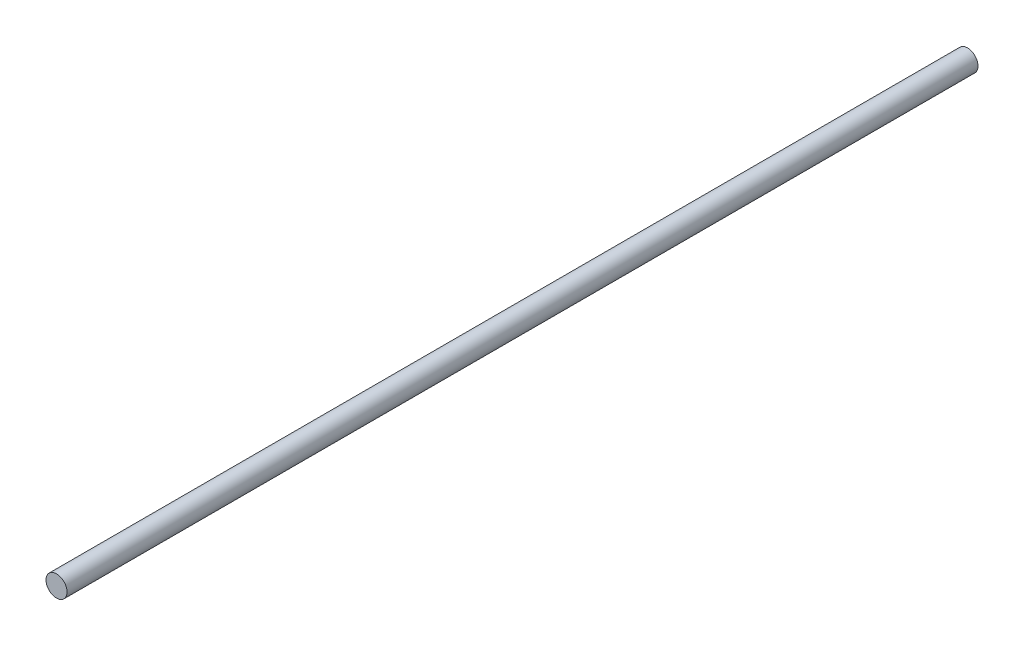
ISO-10303-21;
HEADER;
FILE_DESCRIPTION(('STEP AP214'),'2;1');
FILE_NAME('part.step','',(''),(''),'','','');
FILE_SCHEMA(('AUTOMOTIVE_DESIGN { 1 0 10303 214 1 1 1 1 }'));
ENDSEC;
DATA;
#1=APPLICATION_CONTEXT('core data for automotive mechanical design processes');
#2=APPLICATION_PROTOCOL_DEFINITION('international standard','automotive_design',2000,#1);
#3=PRODUCT_CONTEXT('',#1,'mechanical');
#4=PRODUCT('Part','Part','',(#3));
#5=PRODUCT_RELATED_PRODUCT_CATEGORY('part','',(#4));
#6=PRODUCT_DEFINITION_FORMATION('','',#4);
#7=PRODUCT_DEFINITION_CONTEXT('part definition',#1,'design');
#8=PRODUCT_DEFINITION('design','',#6,#7);
#9=PRODUCT_DEFINITION_SHAPE('','',#8);
#10=(LENGTH_UNIT() NAMED_UNIT(*) SI_UNIT(.MILLI.,.METRE.));
#11=(NAMED_UNIT(*) PLANE_ANGLE_UNIT() SI_UNIT($,.RADIAN.));
#12=(NAMED_UNIT(*) SI_UNIT($,.STERADIAN.) SOLID_ANGLE_UNIT());
#13=UNCERTAINTY_MEASURE_WITH_UNIT(LENGTH_MEASURE(1.E-05),#10,'distance_accuracy_value','');
#14=(GEOMETRIC_REPRESENTATION_CONTEXT(3) GLOBAL_UNCERTAINTY_ASSIGNED_CONTEXT((#13)) GLOBAL_UNIT_ASSIGNED_CONTEXT((#10,
#11,#12)) REPRESENTATION_CONTEXT('',''));
#15=CARTESIAN_POINT('',(0.,0.,0.));
#16=DIRECTION('',(0.,0.,1.));
#17=DIRECTION('',(1.,0.,0.));
#18=AXIS2_PLACEMENT_3D('',#15,#16,#17);
#19=CARTESIAN_POINT('',(0.,0.,86.5));
#20=DIRECTION('',(0.,0.,-1.));
#21=DIRECTION('',(-1.,0.,0.));
#22=AXIS2_PLACEMENT_3D('',#19,#20,#21);
#23=CYLINDRICAL_SURFACE('',#22,2.);
#24=CARTESIAN_POINT('',(0.,0.,86.5));
#25=DIRECTION('',(0.,0.,1.));
#26=DIRECTION('',(1.,0.,0.));
#27=AXIS2_PLACEMENT_3D('',#24,#25,#26);
#28=CIRCLE('',#27,2.);
#29=CARTESIAN_POINT('',(2.,0.,86.5));
#30=VERTEX_POINT('',#29);
#31=EDGE_CURVE('E10',#30,#30,#28,.T.);
#32=ORIENTED_EDGE('',*,*,#31,.F.);
#33=EDGE_LOOP('',(#32));
#34=FACE_BOUND('',#33,.T.);
#35=CARTESIAN_POINT('',(0.,0.,-86.5));
#36=DIRECTION('',(0.,0.,1.));
#37=DIRECTION('',(1.,0.,0.));
#38=AXIS2_PLACEMENT_3D('',#35,#36,#37);
#39=CIRCLE('',#38,2.);
#40=CARTESIAN_POINT('',(2.,0.,-86.5));
#41=VERTEX_POINT('',#40);
#42=EDGE_CURVE('E35',#41,#41,#39,.T.);
#43=ORIENTED_EDGE('',*,*,#42,.T.);
#44=EDGE_LOOP('',(#43));
#45=FACE_BOUND('',#44,.T.);
#46=ADVANCED_FACE('F32',(#34,#45),#23,.T.);
#47=CARTESIAN_POINT('',(0.,0.,86.5));
#48=DIRECTION('',(0.,0.,1.));
#49=DIRECTION('',(1.,0.,0.));
#50=AXIS2_PLACEMENT_3D('',#47,#48,#49);
#51=PLANE('',#50);
#52=ORIENTED_EDGE('',*,*,#31,.T.);
#53=EDGE_LOOP('',(#52));
#54=FACE_BOUND('',#53,.T.);
#55=ADVANCED_FACE('F47',(#54),#51,.T.);
#56=CARTESIAN_POINT('',(0.,0.,-86.5));
#57=DIRECTION('',(0.,0.,1.));
#58=DIRECTION('',(1.,0.,0.));
#59=AXIS2_PLACEMENT_3D('',#56,#57,#58);
#60=PLANE('',#59);
#61=ORIENTED_EDGE('',*,*,#42,.F.);
#62=EDGE_LOOP('',(#61));
#63=FACE_BOUND('',#62,.T.);
#64=ADVANCED_FACE('F45',(#63),#60,.F.);
#65=CLOSED_SHELL('',(#46,#55,#64));
#66=MANIFOLD_SOLID_BREP('B2',#65);
#67=ADVANCED_BREP_SHAPE_REPRESENTATION('',(#18,#66),#14);
#68=SHAPE_DEFINITION_REPRESENTATION(#9,#67);
ENDSEC;
END-ISO-10303-21;
